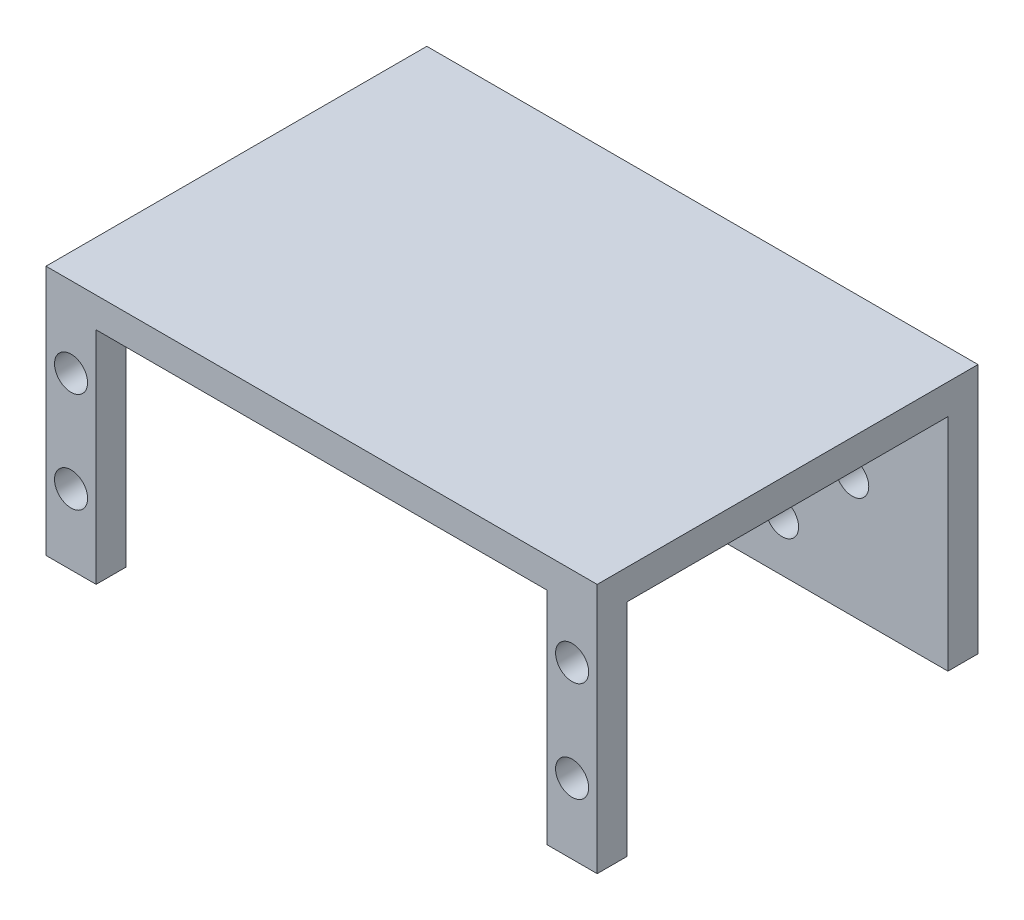
ISO-10303-21;
HEADER;
FILE_DESCRIPTION(('STEP AP214'),'2;1');
FILE_NAME('part.step','',(''),(''),'','','');
FILE_SCHEMA(('AUTOMOTIVE_DESIGN { 1 0 10303 214 1 1 1 1 }'));
ENDSEC;
DATA;
#1=APPLICATION_CONTEXT('core data for automotive mechanical design processes');
#2=APPLICATION_PROTOCOL_DEFINITION('international standard','automotive_design',2000,#1);
#3=PRODUCT_CONTEXT('',#1,'mechanical');
#4=PRODUCT('Part','Part','',(#3));
#5=PRODUCT_RELATED_PRODUCT_CATEGORY('part','',(#4));
#6=PRODUCT_DEFINITION_FORMATION('','',#4);
#7=PRODUCT_DEFINITION_CONTEXT('part definition',#1,'design');
#8=PRODUCT_DEFINITION('design','',#6,#7);
#9=PRODUCT_DEFINITION_SHAPE('','',#8);
#10=(LENGTH_UNIT() NAMED_UNIT(*) SI_UNIT(.MILLI.,.METRE.));
#11=(NAMED_UNIT(*) PLANE_ANGLE_UNIT() SI_UNIT($,.RADIAN.));
#12=(NAMED_UNIT(*) SI_UNIT($,.STERADIAN.) SOLID_ANGLE_UNIT());
#13=UNCERTAINTY_MEASURE_WITH_UNIT(LENGTH_MEASURE(1.E-05),#10,'distance_accuracy_value','');
#14=(GEOMETRIC_REPRESENTATION_CONTEXT(3) GLOBAL_UNCERTAINTY_ASSIGNED_CONTEXT((#13)) GLOBAL_UNIT_ASSIGNED_CONTEXT((#10,
#11,#12)) REPRESENTATION_CONTEXT('',''));
#15=CARTESIAN_POINT('',(0.,0.,0.));
#16=DIRECTION('',(0.,0.,1.));
#17=DIRECTION('',(1.,0.,0.));
#18=AXIS2_PLACEMENT_3D('',#15,#16,#17);
#19=CARTESIAN_POINT('',(-27.5,9.5,38.));
#20=DIRECTION('',(0.,1.,0.));
#21=DIRECTION('',(-1.,0.,0.));
#22=AXIS2_PLACEMENT_3D('',#19,#20,#21);
#23=PLANE('',#22);
#24=DIRECTION('',(0.,0.,-1.));
#25=VECTOR('',#24,1.);
#26=CARTESIAN_POINT('',(22.5,9.5,38.));
#27=LINE('',#26,#25);
#28=CARTESIAN_POINT('',(22.5,9.5,38.));
#29=VERTEX_POINT('',#28);
#30=CARTESIAN_POINT('',(22.5,9.5,35.));
#31=VERTEX_POINT('',#30);
#32=EDGE_CURVE('E156',#29,#31,#27,.T.);
#33=ORIENTED_EDGE('',*,*,#32,.F.);
#34=DIRECTION('',(1.,0.,0.));
#35=VECTOR('',#34,1.);
#36=CARTESIAN_POINT('',(-27.5,9.5,38.));
#37=LINE('',#36,#35);
#38=CARTESIAN_POINT('',(-22.5,9.5,38.));
#39=VERTEX_POINT('',#38);
#40=EDGE_CURVE('E140',#39,#29,#37,.T.);
#41=ORIENTED_EDGE('',*,*,#40,.F.);
#42=DIRECTION('',(0.,0.,1.));
#43=VECTOR('',#42,1.);
#44=CARTESIAN_POINT('',(-22.5,9.5,38.));
#45=LINE('',#44,#43);
#46=CARTESIAN_POINT('',(-22.5,9.5,35.));
#47=VERTEX_POINT('',#46);
#48=EDGE_CURVE('E176',#47,#39,#45,.T.);
#49=ORIENTED_EDGE('',*,*,#48,.F.);
#50=DIRECTION('',(1.,0.,0.));
#51=VECTOR('',#50,1.);
#52=CARTESIAN_POINT('',(-27.5,9.5,35.));
#53=LINE('',#52,#51);
#54=CARTESIAN_POINT('',(-27.5,9.5,35.));
#55=VERTEX_POINT('',#54);
#56=EDGE_CURVE('E171',#55,#47,#53,.T.);
#57=ORIENTED_EDGE('',*,*,#56,.F.);
#58=DIRECTION('',(0.,0.,-1.));
#59=VECTOR('',#58,1.);
#60=CARTESIAN_POINT('',(-27.5,9.5,38.));
#61=LINE('',#60,#59);
#62=CARTESIAN_POINT('',(-27.5,9.5,3.));
#63=VERTEX_POINT('',#62);
#64=EDGE_CURVE('E61',#55,#63,#61,.T.);
#65=ORIENTED_EDGE('',*,*,#64,.T.);
#66=DIRECTION('',(1.,0.,0.));
#67=VECTOR('',#66,1.);
#68=CARTESIAN_POINT('',(-27.5,9.5,3.));
#69=LINE('',#68,#67);
#70=CARTESIAN_POINT('',(27.5,9.5,3.));
#71=VERTEX_POINT('',#70);
#72=EDGE_CURVE('E191',#63,#71,#69,.T.);
#73=ORIENTED_EDGE('',*,*,#72,.T.);
#74=DIRECTION('',(0.,0.,-1.));
#75=VECTOR('',#74,1.);
#76=CARTESIAN_POINT('',(27.5,9.5,38.));
#77=LINE('',#76,#75);
#78=CARTESIAN_POINT('',(27.5,9.5,35.));
#79=VERTEX_POINT('',#78);
#80=EDGE_CURVE('E196',#79,#71,#77,.T.);
#81=ORIENTED_EDGE('',*,*,#80,.F.);
#82=DIRECTION('',(1.,0.,0.));
#83=VECTOR('',#82,1.);
#84=CARTESIAN_POINT('',(27.5,9.5,35.));
#85=LINE('',#84,#83);
#86=EDGE_CURVE('E154',#31,#79,#85,.T.);
#87=ORIENTED_EDGE('',*,*,#86,.F.);
#88=EDGE_LOOP('',(#33,#41,#49,#57,#65,#73,#81,#87));
#89=FACE_BOUND('',#88,.T.);
#90=ADVANCED_FACE('F36',(#89),#23,.F.);
#91=CARTESIAN_POINT('',(0.,0.,3.));
#92=DIRECTION('',(0.,0.,-1.));
#93=DIRECTION('',(-1.,0.,0.));
#94=AXIS2_PLACEMENT_3D('',#91,#92,#93);
#95=PLANE('',#94);
#96=CARTESIAN_POINT('',(17.95,-0.499999999999997,3.));
#97=DIRECTION('',(0.,0.,1.));
#98=DIRECTION('',(1.,0.,0.));
#99=AXIS2_PLACEMENT_3D('',#96,#97,#98);
#100=CIRCLE('',#99,1.65);
#101=CARTESIAN_POINT('',(19.6,-0.499999999999997,3.));
#102=VERTEX_POINT('',#101);
#103=EDGE_CURVE('E227',#102,#102,#100,.T.);
#104=ORIENTED_EDGE('',*,*,#103,.F.);
#105=EDGE_LOOP('',(#104));
#106=FACE_BOUND('',#105,.T.);
#107=CARTESIAN_POINT('',(10.95,6.5,3.));
#108=DIRECTION('',(0.,0.,1.));
#109=DIRECTION('',(1.,0.,0.));
#110=AXIS2_PLACEMENT_3D('',#107,#108,#109);
#111=CIRCLE('',#110,1.65);
#112=CARTESIAN_POINT('',(12.6,6.5,3.));
#113=VERTEX_POINT('',#112);
#114=EDGE_CURVE('E531',#113,#113,#111,.T.);
#115=ORIENTED_EDGE('',*,*,#114,.F.);
#116=EDGE_LOOP('',(#115));
#117=FACE_BOUND('',#116,.T.);
#118=CARTESIAN_POINT('',(3.94999999999999,-0.499999999999997,3.));
#119=DIRECTION('',(0.,0.,1.));
#120=DIRECTION('',(1.,0.,0.));
#121=AXIS2_PLACEMENT_3D('',#118,#119,#120);
#122=CIRCLE('',#121,1.65);
#123=CARTESIAN_POINT('',(5.59999999999999,-0.499999999999997,3.));
#124=VERTEX_POINT('',#123);
#125=EDGE_CURVE('E534',#124,#124,#122,.T.);
#126=ORIENTED_EDGE('',*,*,#125,.F.);
#127=EDGE_LOOP('',(#126));
#128=FACE_BOUND('',#127,.T.);
#129=CARTESIAN_POINT('',(10.95,-7.5,3.));
#130=DIRECTION('',(0.,0.,1.));
#131=DIRECTION('',(1.,0.,0.));
#132=AXIS2_PLACEMENT_3D('',#129,#130,#131);
#133=CIRCLE('',#132,1.65);
#134=CARTESIAN_POINT('',(12.6,-7.5,3.));
#135=VERTEX_POINT('',#134);
#136=EDGE_CURVE('E538',#135,#135,#133,.T.);
#137=ORIENTED_EDGE('',*,*,#136,.F.);
#138=EDGE_LOOP('',(#137));
#139=FACE_BOUND('',#138,.T.);
#140=ORIENTED_EDGE('',*,*,#72,.F.);
#141=DIRECTION('',(0.,-1.,0.));
#142=VECTOR('',#141,1.);
#143=CARTESIAN_POINT('',(-27.5,-12.5,3.));
#144=LINE('',#143,#142);
#145=CARTESIAN_POINT('',(-27.5,-12.5,3.));
#146=VERTEX_POINT('',#145);
#147=EDGE_CURVE('E204',#63,#146,#144,.T.);
#148=ORIENTED_EDGE('',*,*,#147,.T.);
#149=DIRECTION('',(1.,0.,0.));
#150=VECTOR('',#149,1.);
#151=CARTESIAN_POINT('',(-27.5,-12.5,3.));
#152=LINE('',#151,#150);
#153=CARTESIAN_POINT('',(27.5,-12.5,3.));
#154=VERTEX_POINT('',#153);
#155=EDGE_CURVE('E207',#146,#154,#152,.T.);
#156=ORIENTED_EDGE('',*,*,#155,.T.);
#157=DIRECTION('',(0.,1.,0.));
#158=VECTOR('',#157,1.);
#159=CARTESIAN_POINT('',(27.5,-12.5,3.));
#160=LINE('',#159,#158);
#161=EDGE_CURVE('E201',#154,#71,#160,.T.);
#162=ORIENTED_EDGE('',*,*,#161,.T.);
#163=EDGE_LOOP('',(#140,#148,#156,#162));
#164=FACE_BOUND('',#163,.T.);
#165=ADVANCED_FACE('F283',(#106,#117,#128,#139,#164),#95,.F.);
#166=CARTESIAN_POINT('',(27.5,-12.5,3.));
#167=DIRECTION('',(-1.,0.,0.));
#168=DIRECTION('',(0.,0.,1.));
#169=AXIS2_PLACEMENT_3D('',#166,#167,#168);
#170=PLANE('',#169);
#171=DIRECTION('',(0.,1.,0.));
#172=VECTOR('',#171,1.);
#173=CARTESIAN_POINT('',(27.5,-12.5,0.));
#174=LINE('',#173,#172);
#175=CARTESIAN_POINT('',(27.5,-12.5,0.));
#176=VERTEX_POINT('',#175);
#177=CARTESIAN_POINT('',(27.5,12.5,0.));
#178=VERTEX_POINT('',#177);
#179=EDGE_CURVE('E200',#176,#178,#174,.T.);
#180=ORIENTED_EDGE('',*,*,#179,.T.);
#181=DIRECTION('',(0.,0.,-1.));
#182=VECTOR('',#181,1.);
#183=CARTESIAN_POINT('',(27.5,12.5,3.));
#184=LINE('',#183,#182);
#185=CARTESIAN_POINT('',(27.5,12.5,38.));
#186=VERTEX_POINT('',#185);
#187=EDGE_CURVE('E11',#186,#178,#184,.T.);
#188=ORIENTED_EDGE('',*,*,#187,.F.);
#189=DIRECTION('',(0.,1.,0.));
#190=VECTOR('',#189,1.);
#191=CARTESIAN_POINT('',(27.5,12.5,38.));
#192=LINE('',#191,#190);
#193=CARTESIAN_POINT('',(27.5,-12.5,38.));
#194=VERTEX_POINT('',#193);
#195=EDGE_CURVE('E131',#194,#186,#192,.T.);
#196=ORIENTED_EDGE('',*,*,#195,.F.);
#197=DIRECTION('',(0.,0.,1.));
#198=VECTOR('',#197,1.);
#199=CARTESIAN_POINT('',(27.5,-12.5,38.));
#200=LINE('',#199,#198);
#201=CARTESIAN_POINT('',(27.5,-12.5,35.));
#202=VERTEX_POINT('',#201);
#203=EDGE_CURVE('E136',#202,#194,#200,.T.);
#204=ORIENTED_EDGE('',*,*,#203,.F.);
#205=DIRECTION('',(0.,1.,0.));
#206=VECTOR('',#205,1.);
#207=CARTESIAN_POINT('',(27.5,-12.5,35.));
#208=LINE('',#207,#206);
#209=EDGE_CURVE('E164',#202,#79,#208,.T.);
#210=ORIENTED_EDGE('',*,*,#209,.T.);
#211=ORIENTED_EDGE('',*,*,#80,.T.);
#212=ORIENTED_EDGE('',*,*,#161,.F.);
#213=DIRECTION('',(0.,0.,-1.));
#214=VECTOR('',#213,1.);
#215=CARTESIAN_POINT('',(27.5,-12.5,3.));
#216=LINE('',#215,#214);
#217=EDGE_CURVE('E209',#154,#176,#216,.T.);
#218=ORIENTED_EDGE('',*,*,#217,.T.);
#219=EDGE_LOOP('',(#180,#188,#196,#204,#210,#211,#212,#218));
#220=FACE_BOUND('',#219,.T.);
#221=ADVANCED_FACE('F38',(#220),#170,.F.);
#222=CARTESIAN_POINT('',(-27.5,12.5,3.));
#223=DIRECTION('',(0.,-1.,0.));
#224=DIRECTION('',(0.,0.,-1.));
#225=AXIS2_PLACEMENT_3D('',#222,#223,#224);
#226=PLANE('',#225);
#227=DIRECTION('',(-1.,0.,0.));
#228=VECTOR('',#227,1.);
#229=CARTESIAN_POINT('',(-27.5,12.5,0.));
#230=LINE('',#229,#228);
#231=CARTESIAN_POINT('',(-27.5,12.5,0.));
#232=VERTEX_POINT('',#231);
#233=EDGE_CURVE('E211',#178,#232,#230,.T.);
#234=ORIENTED_EDGE('',*,*,#233,.T.);
#235=DIRECTION('',(0.,0.,-1.));
#236=VECTOR('',#235,1.);
#237=CARTESIAN_POINT('',(-27.5,12.5,3.));
#238=LINE('',#237,#236);
#239=CARTESIAN_POINT('',(-27.5,12.5,38.));
#240=VERTEX_POINT('',#239);
#241=EDGE_CURVE('E45',#240,#232,#238,.T.);
#242=ORIENTED_EDGE('',*,*,#241,.F.);
#243=DIRECTION('',(-1.,0.,0.));
#244=VECTOR('',#243,1.);
#245=CARTESIAN_POINT('',(-27.5,12.5,38.));
#246=LINE('',#245,#244);
#247=EDGE_CURVE('E139',#186,#240,#246,.T.);
#248=ORIENTED_EDGE('',*,*,#247,.F.);
#249=ORIENTED_EDGE('',*,*,#187,.T.);
#250=EDGE_LOOP('',(#234,#242,#248,#249));
#251=FACE_BOUND('',#250,.T.);
#252=ADVANCED_FACE('F298',(#251),#226,.F.);
#253=CARTESIAN_POINT('',(-27.5,-12.5,3.));
#254=DIRECTION('',(1.,0.,0.));
#255=DIRECTION('',(0.,0.,-1.));
#256=AXIS2_PLACEMENT_3D('',#253,#254,#255);
#257=PLANE('',#256);
#258=DIRECTION('',(0.,-1.,0.));
#259=VECTOR('',#258,1.);
#260=CARTESIAN_POINT('',(-27.5,-12.5,0.));
#261=LINE('',#260,#259);
#262=CARTESIAN_POINT('',(-27.5,-12.5,0.));
#263=VERTEX_POINT('',#262);
#264=EDGE_CURVE('E213',#232,#263,#261,.T.);
#265=ORIENTED_EDGE('',*,*,#264,.T.);
#266=DIRECTION('',(0.,0.,-1.));
#267=VECTOR('',#266,1.);
#268=CARTESIAN_POINT('',(-27.5,-12.5,3.));
#269=LINE('',#268,#267);
#270=EDGE_CURVE('E218',#146,#263,#269,.T.);
#271=ORIENTED_EDGE('',*,*,#270,.F.);
#272=ORIENTED_EDGE('',*,*,#147,.F.);
#273=ORIENTED_EDGE('',*,*,#64,.F.);
#274=DIRECTION('',(0.,1.,0.));
#275=VECTOR('',#274,1.);
#276=CARTESIAN_POINT('',(-27.5,-12.5,35.));
#277=LINE('',#276,#275);
#278=CARTESIAN_POINT('',(-27.5,-12.5,35.));
#279=VERTEX_POINT('',#278);
#280=EDGE_CURVE('E189',#279,#55,#277,.T.);
#281=ORIENTED_EDGE('',*,*,#280,.F.);
#282=DIRECTION('',(0.,0.,-1.));
#283=VECTOR('',#282,1.);
#284=CARTESIAN_POINT('',(-27.5,-12.5,38.));
#285=LINE('',#284,#283);
#286=CARTESIAN_POINT('',(-27.5,-12.5,38.));
#287=VERTEX_POINT('',#286);
#288=EDGE_CURVE('E172',#287,#279,#285,.T.);
#289=ORIENTED_EDGE('',*,*,#288,.F.);
#290=DIRECTION('',(0.,-1.,0.));
#291=VECTOR('',#290,1.);
#292=CARTESIAN_POINT('',(-27.5,12.5,38.));
#293=LINE('',#292,#291);
#294=EDGE_CURVE('E192',#240,#287,#293,.T.);
#295=ORIENTED_EDGE('',*,*,#294,.F.);
#296=ORIENTED_EDGE('',*,*,#241,.T.);
#297=EDGE_LOOP('',(#265,#271,#272,#273,#281,#289,#295,#296));
#298=FACE_BOUND('',#297,.T.);
#299=ADVANCED_FACE('F286',(#298),#257,.F.);
#300=CARTESIAN_POINT('',(-27.5,-12.5,3.));
#301=DIRECTION('',(0.,1.,0.));
#302=DIRECTION('',(0.,0.,1.));
#303=AXIS2_PLACEMENT_3D('',#300,#301,#302);
#304=PLANE('',#303);
#305=DIRECTION('',(1.,0.,0.));
#306=VECTOR('',#305,1.);
#307=CARTESIAN_POINT('',(-27.5,-12.5,0.));
#308=LINE('',#307,#306);
#309=EDGE_CURVE('E205',#263,#176,#308,.T.);
#310=ORIENTED_EDGE('',*,*,#309,.T.);
#311=ORIENTED_EDGE('',*,*,#217,.F.);
#312=ORIENTED_EDGE('',*,*,#155,.F.);
#313=ORIENTED_EDGE('',*,*,#270,.T.);
#314=EDGE_LOOP('',(#310,#311,#312,#313));
#315=FACE_BOUND('',#314,.T.);
#316=ADVANCED_FACE('F293',(#315),#304,.F.);
#317=CARTESIAN_POINT('',(0.,0.,0.));
#318=DIRECTION('',(0.,0.,-1.));
#319=DIRECTION('',(-1.,0.,0.));
#320=AXIS2_PLACEMENT_3D('',#317,#318,#319);
#321=PLANE('',#320);
#322=CARTESIAN_POINT('',(17.95,-0.499999999999997,0.));
#323=DIRECTION('',(0.,0.,-1.));
#324=DIRECTION('',(-1.,0.,0.));
#325=AXIS2_PLACEMENT_3D('',#322,#323,#324);
#326=CIRCLE('',#325,1.65);
#327=CARTESIAN_POINT('',(16.3,-0.499999999999997,0.));
#328=VERTEX_POINT('',#327);
#329=EDGE_CURVE('E40',#328,#328,#326,.T.);
#330=ORIENTED_EDGE('',*,*,#329,.F.);
#331=EDGE_LOOP('',(#330));
#332=FACE_BOUND('',#331,.T.);
#333=CARTESIAN_POINT('',(10.95,6.5,0.));
#334=DIRECTION('',(0.,0.,-1.));
#335=DIRECTION('',(-1.,0.,0.));
#336=AXIS2_PLACEMENT_3D('',#333,#334,#335);
#337=CIRCLE('',#336,1.65);
#338=CARTESIAN_POINT('',(9.29999999999999,6.5,0.));
#339=VERTEX_POINT('',#338);
#340=EDGE_CURVE('E229',#339,#339,#337,.T.);
#341=ORIENTED_EDGE('',*,*,#340,.F.);
#342=EDGE_LOOP('',(#341));
#343=FACE_BOUND('',#342,.T.);
#344=CARTESIAN_POINT('',(3.94999999999999,-0.499999999999997,0.));
#345=DIRECTION('',(0.,0.,-1.));
#346=DIRECTION('',(-1.,0.,0.));
#347=AXIS2_PLACEMENT_3D('',#344,#345,#346);
#348=CIRCLE('',#347,1.65);
#349=CARTESIAN_POINT('',(2.29999999999999,-0.499999999999997,0.));
#350=VERTEX_POINT('',#349);
#351=EDGE_CURVE('E226',#350,#350,#348,.T.);
#352=ORIENTED_EDGE('',*,*,#351,.F.);
#353=EDGE_LOOP('',(#352));
#354=FACE_BOUND('',#353,.T.);
#355=CARTESIAN_POINT('',(10.95,-7.5,0.));
#356=DIRECTION('',(0.,0.,-1.));
#357=DIRECTION('',(-1.,0.,0.));
#358=AXIS2_PLACEMENT_3D('',#355,#356,#357);
#359=CIRCLE('',#358,1.65);
#360=CARTESIAN_POINT('',(9.29999999999999,-7.5,0.));
#361=VERTEX_POINT('',#360);
#362=EDGE_CURVE('E223',#361,#361,#359,.T.);
#363=ORIENTED_EDGE('',*,*,#362,.F.);
#364=EDGE_LOOP('',(#363));
#365=FACE_BOUND('',#364,.T.);
#366=ORIENTED_EDGE('',*,*,#179,.F.);
#367=ORIENTED_EDGE('',*,*,#309,.F.);
#368=ORIENTED_EDGE('',*,*,#264,.F.);
#369=ORIENTED_EDGE('',*,*,#233,.F.);
#370=EDGE_LOOP('',(#366,#367,#368,#369));
#371=FACE_BOUND('',#370,.T.);
#372=ADVANCED_FACE('F296',(#332,#343,#354,#365,#371),#321,.T.);
#373=CARTESIAN_POINT('',(0.,0.,38.));
#374=DIRECTION('',(0.,0.,1.));
#375=DIRECTION('',(1.,0.,0.));
#376=AXIS2_PLACEMENT_3D('',#373,#374,#375);
#377=PLANE('',#376);
#378=CARTESIAN_POINT('',(25.,-5.5,38.));
#379=DIRECTION('',(0.,0.,1.));
#380=DIRECTION('',(-1.,0.,0.));
#381=AXIS2_PLACEMENT_3D('',#378,#379,#380);
#382=CIRCLE('',#381,1.65);
#383=CARTESIAN_POINT('',(23.35,-5.5,38.));
#384=VERTEX_POINT('',#383);
#385=EDGE_CURVE('E234',#384,#384,#382,.T.);
#386=ORIENTED_EDGE('',*,*,#385,.F.);
#387=EDGE_LOOP('',(#386));
#388=FACE_BOUND('',#387,.T.);
#389=CARTESIAN_POINT('',(25.,4.5,38.));
#390=DIRECTION('',(0.,0.,1.));
#391=DIRECTION('',(-1.,0.,0.));
#392=AXIS2_PLACEMENT_3D('',#389,#390,#391);
#393=CIRCLE('',#392,1.65);
#394=CARTESIAN_POINT('',(23.35,4.5,38.));
#395=VERTEX_POINT('',#394);
#396=EDGE_CURVE('E243',#395,#395,#393,.T.);
#397=ORIENTED_EDGE('',*,*,#396,.F.);
#398=EDGE_LOOP('',(#397));
#399=FACE_BOUND('',#398,.T.);
#400=CARTESIAN_POINT('',(-25.,4.5,38.));
#401=DIRECTION('',(0.,0.,1.));
#402=DIRECTION('',(1.,0.,0.));
#403=AXIS2_PLACEMENT_3D('',#400,#401,#402);
#404=CIRCLE('',#403,1.65);
#405=CARTESIAN_POINT('',(-23.35,4.5,38.));
#406=VERTEX_POINT('',#405);
#407=EDGE_CURVE('E255',#406,#406,#404,.T.);
#408=ORIENTED_EDGE('',*,*,#407,.F.);
#409=EDGE_LOOP('',(#408));
#410=FACE_BOUND('',#409,.T.);
#411=CARTESIAN_POINT('',(-25.,-5.5,38.));
#412=DIRECTION('',(0.,0.,1.));
#413=DIRECTION('',(1.,0.,0.));
#414=AXIS2_PLACEMENT_3D('',#411,#412,#413);
#415=CIRCLE('',#414,1.65);
#416=CARTESIAN_POINT('',(-23.35,-5.5,38.));
#417=VERTEX_POINT('',#416);
#418=EDGE_CURVE('E248',#417,#417,#415,.T.);
#419=ORIENTED_EDGE('',*,*,#418,.F.);
#420=EDGE_LOOP('',(#419));
#421=FACE_BOUND('',#420,.T.);
#422=ORIENTED_EDGE('',*,*,#294,.T.);
#423=DIRECTION('',(-1.,0.,0.));
#424=VECTOR('',#423,1.);
#425=CARTESIAN_POINT('',(-27.5,-12.5,38.));
#426=LINE('',#425,#424);
#427=CARTESIAN_POINT('',(-22.5,-12.5,38.));
#428=VERTEX_POINT('',#427);
#429=EDGE_CURVE('E180',#428,#287,#426,.T.);
#430=ORIENTED_EDGE('',*,*,#429,.F.);
#431=DIRECTION('',(0.,1.,0.));
#432=VECTOR('',#431,1.);
#433=CARTESIAN_POINT('',(-22.5,-12.5,38.));
#434=LINE('',#433,#432);
#435=EDGE_CURVE('E53',#428,#39,#434,.T.);
#436=ORIENTED_EDGE('',*,*,#435,.T.);
#437=ORIENTED_EDGE('',*,*,#40,.T.);
#438=DIRECTION('',(0.,1.,0.));
#439=VECTOR('',#438,1.);
#440=CARTESIAN_POINT('',(22.5,-12.5,38.));
#441=LINE('',#440,#439);
#442=CARTESIAN_POINT('',(22.5,-12.5,38.));
#443=VERTEX_POINT('',#442);
#444=EDGE_CURVE('E145',#443,#29,#441,.T.);
#445=ORIENTED_EDGE('',*,*,#444,.F.);
#446=DIRECTION('',(-1.,0.,0.));
#447=VECTOR('',#446,1.);
#448=CARTESIAN_POINT('',(27.5,-12.5,38.));
#449=LINE('',#448,#447);
#450=EDGE_CURVE('E143',#194,#443,#449,.T.);
#451=ORIENTED_EDGE('',*,*,#450,.F.);
#452=ORIENTED_EDGE('',*,*,#195,.T.);
#453=ORIENTED_EDGE('',*,*,#247,.T.);
#454=EDGE_LOOP('',(#422,#430,#436,#437,#445,#451,#452,#453));
#455=FACE_BOUND('',#454,.T.);
#456=ADVANCED_FACE('F144',(#388,#399,#410,#421,#455),#377,.T.);
#457=CARTESIAN_POINT('',(-27.5,-12.5,35.));
#458=DIRECTION('',(0.,0.,1.));
#459=DIRECTION('',(1.,0.,0.));
#460=AXIS2_PLACEMENT_3D('',#457,#458,#459);
#461=PLANE('',#460);
#462=CARTESIAN_POINT('',(-25.,4.5,35.));
#463=DIRECTION('',(0.,0.,1.));
#464=DIRECTION('',(1.,0.,0.));
#465=AXIS2_PLACEMENT_3D('',#462,#463,#464);
#466=CIRCLE('',#465,1.65);
#467=CARTESIAN_POINT('',(-23.35,4.5,35.));
#468=VERTEX_POINT('',#467);
#469=EDGE_CURVE('E250',#468,#468,#466,.F.);
#470=ORIENTED_EDGE('',*,*,#469,.F.);
#471=EDGE_LOOP('',(#470));
#472=FACE_BOUND('',#471,.T.);
#473=CARTESIAN_POINT('',(-25.,-5.5,35.));
#474=DIRECTION('',(0.,0.,1.));
#475=DIRECTION('',(1.,0.,0.));
#476=AXIS2_PLACEMENT_3D('',#473,#474,#475);
#477=CIRCLE('',#476,1.65);
#478=CARTESIAN_POINT('',(-23.35,-5.5,35.));
#479=VERTEX_POINT('',#478);
#480=EDGE_CURVE('E159',#479,#479,#477,.F.);
#481=ORIENTED_EDGE('',*,*,#480,.F.);
#482=EDGE_LOOP('',(#481));
#483=FACE_BOUND('',#482,.T.);
#484=ORIENTED_EDGE('',*,*,#56,.T.);
#485=DIRECTION('',(0.,1.,0.));
#486=VECTOR('',#485,1.);
#487=CARTESIAN_POINT('',(-22.5,-12.5,35.));
#488=LINE('',#487,#486);
#489=CARTESIAN_POINT('',(-22.5,-12.5,35.));
#490=VERTEX_POINT('',#489);
#491=EDGE_CURVE('E186',#490,#47,#488,.T.);
#492=ORIENTED_EDGE('',*,*,#491,.F.);
#493=DIRECTION('',(1.,0.,0.));
#494=VECTOR('',#493,1.);
#495=CARTESIAN_POINT('',(-27.5,-12.5,35.));
#496=LINE('',#495,#494);
#497=EDGE_CURVE('E175',#279,#490,#496,.T.);
#498=ORIENTED_EDGE('',*,*,#497,.F.);
#499=ORIENTED_EDGE('',*,*,#280,.T.);
#500=EDGE_LOOP('',(#484,#492,#498,#499));
#501=FACE_BOUND('',#500,.T.);
#502=ADVANCED_FACE('F462',(#472,#483,#501),#461,.F.);
#503=CARTESIAN_POINT('',(-22.5,-12.5,38.));
#504=DIRECTION('',(-1.,0.,0.));
#505=DIRECTION('',(0.,-1.,0.));
#506=AXIS2_PLACEMENT_3D('',#503,#504,#505);
#507=PLANE('',#506);
#508=ORIENTED_EDGE('',*,*,#48,.T.);
#509=ORIENTED_EDGE('',*,*,#435,.F.);
#510=DIRECTION('',(0.,0.,1.));
#511=VECTOR('',#510,1.);
#512=CARTESIAN_POINT('',(-22.5,-12.5,38.));
#513=LINE('',#512,#511);
#514=EDGE_CURVE('E178',#490,#428,#513,.T.);
#515=ORIENTED_EDGE('',*,*,#514,.F.);
#516=ORIENTED_EDGE('',*,*,#491,.T.);
#517=EDGE_LOOP('',(#508,#509,#515,#516));
#518=FACE_BOUND('',#517,.T.);
#519=ADVANCED_FACE('F306',(#518),#507,.F.);
#520=CARTESIAN_POINT('',(0.,-12.5,0.));
#521=DIRECTION('',(0.,-1.,0.));
#522=DIRECTION('',(1.,0.,0.));
#523=AXIS2_PLACEMENT_3D('',#520,#521,#522);
#524=PLANE('',#523);
#525=ORIENTED_EDGE('',*,*,#288,.T.);
#526=ORIENTED_EDGE('',*,*,#497,.T.);
#527=ORIENTED_EDGE('',*,*,#514,.T.);
#528=ORIENTED_EDGE('',*,*,#429,.T.);
#529=EDGE_LOOP('',(#525,#526,#527,#528));
#530=FACE_BOUND('',#529,.T.);
#531=ADVANCED_FACE('F302',(#530),#524,.T.);
#532=CARTESIAN_POINT('',(22.5,-12.5,38.));
#533=DIRECTION('',(1.,0.,0.));
#534=DIRECTION('',(0.,1.,0.));
#535=AXIS2_PLACEMENT_3D('',#532,#533,#534);
#536=PLANE('',#535);
#537=ORIENTED_EDGE('',*,*,#32,.T.);
#538=DIRECTION('',(0.,1.,0.));
#539=VECTOR('',#538,1.);
#540=CARTESIAN_POINT('',(22.5,-12.5,35.));
#541=LINE('',#540,#539);
#542=CARTESIAN_POINT('',(22.5,-12.5,35.));
#543=VERTEX_POINT('',#542);
#544=EDGE_CURVE('E167',#543,#31,#541,.T.);
#545=ORIENTED_EDGE('',*,*,#544,.F.);
#546=DIRECTION('',(0.,0.,-1.));
#547=VECTOR('',#546,1.);
#548=CARTESIAN_POINT('',(22.5,-12.5,38.));
#549=LINE('',#548,#547);
#550=EDGE_CURVE('E148',#443,#543,#549,.T.);
#551=ORIENTED_EDGE('',*,*,#550,.F.);
#552=ORIENTED_EDGE('',*,*,#444,.T.);
#553=EDGE_LOOP('',(#537,#545,#551,#552));
#554=FACE_BOUND('',#553,.T.);
#555=ADVANCED_FACE('F273',(#554),#536,.F.);
#556=CARTESIAN_POINT('',(27.5,-12.5,35.));
#557=DIRECTION('',(0.,0.,1.));
#558=DIRECTION('',(1.,0.,0.));
#559=AXIS2_PLACEMENT_3D('',#556,#557,#558);
#560=PLANE('',#559);
#561=CARTESIAN_POINT('',(25.,-5.5,35.));
#562=DIRECTION('',(0.,0.,1.));
#563=DIRECTION('',(1.,0.,0.));
#564=AXIS2_PLACEMENT_3D('',#561,#562,#563);
#565=CIRCLE('',#564,1.65);
#566=CARTESIAN_POINT('',(26.65,-5.5,35.));
#567=VERTEX_POINT('',#566);
#568=EDGE_CURVE('E238',#567,#567,#565,.F.);
#569=ORIENTED_EDGE('',*,*,#568,.F.);
#570=EDGE_LOOP('',(#569));
#571=FACE_BOUND('',#570,.T.);
#572=CARTESIAN_POINT('',(25.,4.5,35.));
#573=DIRECTION('',(0.,0.,1.));
#574=DIRECTION('',(1.,0.,0.));
#575=AXIS2_PLACEMENT_3D('',#572,#573,#574);
#576=CIRCLE('',#575,1.65);
#577=CARTESIAN_POINT('',(26.65,4.5,35.));
#578=VERTEX_POINT('',#577);
#579=EDGE_CURVE('E246',#578,#578,#576,.F.);
#580=ORIENTED_EDGE('',*,*,#579,.F.);
#581=EDGE_LOOP('',(#580));
#582=FACE_BOUND('',#581,.T.);
#583=ORIENTED_EDGE('',*,*,#86,.T.);
#584=ORIENTED_EDGE('',*,*,#209,.F.);
#585=DIRECTION('',(1.,0.,0.));
#586=VECTOR('',#585,1.);
#587=CARTESIAN_POINT('',(27.5,-12.5,35.));
#588=LINE('',#587,#586);
#589=EDGE_CURVE('E152',#543,#202,#588,.T.);
#590=ORIENTED_EDGE('',*,*,#589,.F.);
#591=ORIENTED_EDGE('',*,*,#544,.T.);
#592=EDGE_LOOP('',(#583,#584,#590,#591));
#593=FACE_BOUND('',#592,.T.);
#594=ADVANCED_FACE('F270',(#571,#582,#593),#560,.F.);
#595=CARTESIAN_POINT('',(0.,-12.5,0.));
#596=DIRECTION('',(0.,1.,0.));
#597=DIRECTION('',(-1.,0.,0.));
#598=AXIS2_PLACEMENT_3D('',#595,#596,#597);
#599=PLANE('',#598);
#600=ORIENTED_EDGE('',*,*,#203,.T.);
#601=ORIENTED_EDGE('',*,*,#450,.T.);
#602=ORIENTED_EDGE('',*,*,#550,.T.);
#603=ORIENTED_EDGE('',*,*,#589,.T.);
#604=EDGE_LOOP('',(#600,#601,#602,#603));
#605=FACE_BOUND('',#604,.T.);
#606=ADVANCED_FACE('F150',(#605),#599,.F.);
#607=CARTESIAN_POINT('',(25.,4.5,-0.001000000000001));
#608=DIRECTION('',(0.,0.,1.));
#609=DIRECTION('',(1.,0.,0.));
#610=AXIS2_PLACEMENT_3D('',#607,#608,#609);
#611=CYLINDRICAL_SURFACE('',#610,1.65);
#612=ORIENTED_EDGE('',*,*,#396,.T.);
#613=EDGE_LOOP('',(#612));
#614=FACE_BOUND('',#613,.T.);
#615=ORIENTED_EDGE('',*,*,#579,.T.);
#616=EDGE_LOOP('',(#615));
#617=FACE_BOUND('',#616,.T.);
#618=ADVANCED_FACE('F268',(#614,#617),#611,.F.);
#619=CARTESIAN_POINT('',(25.,-5.5,-0.001000000000001));
#620=DIRECTION('',(0.,0.,1.));
#621=DIRECTION('',(1.,0.,0.));
#622=AXIS2_PLACEMENT_3D('',#619,#620,#621);
#623=CYLINDRICAL_SURFACE('',#622,1.65);
#624=ORIENTED_EDGE('',*,*,#385,.T.);
#625=EDGE_LOOP('',(#624));
#626=FACE_BOUND('',#625,.T.);
#627=ORIENTED_EDGE('',*,*,#568,.T.);
#628=EDGE_LOOP('',(#627));
#629=FACE_BOUND('',#628,.T.);
#630=ADVANCED_FACE('F407',(#626,#629),#623,.F.);
#631=CARTESIAN_POINT('',(-25.,-5.5,-0.001000000000001));
#632=DIRECTION('',(0.,0.,1.));
#633=DIRECTION('',(1.,0.,0.));
#634=AXIS2_PLACEMENT_3D('',#631,#632,#633);
#635=CYLINDRICAL_SURFACE('',#634,1.65);
#636=ORIENTED_EDGE('',*,*,#418,.T.);
#637=EDGE_LOOP('',(#636));
#638=FACE_BOUND('',#637,.T.);
#639=ORIENTED_EDGE('',*,*,#480,.T.);
#640=EDGE_LOOP('',(#639));
#641=FACE_BOUND('',#640,.T.);
#642=ADVANCED_FACE('F403',(#638,#641),#635,.F.);
#643=CARTESIAN_POINT('',(-25.,4.5,-0.001000000000001));
#644=DIRECTION('',(0.,0.,1.));
#645=DIRECTION('',(1.,0.,0.));
#646=AXIS2_PLACEMENT_3D('',#643,#644,#645);
#647=CYLINDRICAL_SURFACE('',#646,1.65);
#648=ORIENTED_EDGE('',*,*,#407,.T.);
#649=EDGE_LOOP('',(#648));
#650=FACE_BOUND('',#649,.T.);
#651=ORIENTED_EDGE('',*,*,#469,.T.);
#652=EDGE_LOOP('',(#651));
#653=FACE_BOUND('',#652,.T.);
#654=ADVANCED_FACE('F351',(#650,#653),#647,.F.);
#655=CARTESIAN_POINT('',(10.95,-7.5,-17.));
#656=DIRECTION('',(0.,0.,1.));
#657=DIRECTION('',(1.,0.,0.));
#658=AXIS2_PLACEMENT_3D('',#655,#656,#657);
#659=CYLINDRICAL_SURFACE('',#658,1.65);
#660=ORIENTED_EDGE('',*,*,#362,.T.);
#661=EDGE_LOOP('',(#660));
#662=FACE_BOUND('',#661,.T.);
#663=ORIENTED_EDGE('',*,*,#136,.T.);
#664=EDGE_LOOP('',(#663));
#665=FACE_BOUND('',#664,.T.);
#666=ADVANCED_FACE('F363',(#662,#665),#659,.F.);
#667=CARTESIAN_POINT('',(3.94999999999999,-0.499999999999997,-17.));
#668=DIRECTION('',(0.,0.,1.));
#669=DIRECTION('',(1.,0.,0.));
#670=AXIS2_PLACEMENT_3D('',#667,#668,#669);
#671=CYLINDRICAL_SURFACE('',#670,1.65);
#672=ORIENTED_EDGE('',*,*,#351,.T.);
#673=EDGE_LOOP('',(#672));
#674=FACE_BOUND('',#673,.T.);
#675=ORIENTED_EDGE('',*,*,#125,.T.);
#676=EDGE_LOOP('',(#675));
#677=FACE_BOUND('',#676,.T.);
#678=ADVANCED_FACE('F368',(#674,#677),#671,.F.);
#679=CARTESIAN_POINT('',(10.95,6.5,-17.));
#680=DIRECTION('',(0.,0.,1.));
#681=DIRECTION('',(1.,0.,0.));
#682=AXIS2_PLACEMENT_3D('',#679,#680,#681);
#683=CYLINDRICAL_SURFACE('',#682,1.65);
#684=ORIENTED_EDGE('',*,*,#340,.T.);
#685=EDGE_LOOP('',(#684));
#686=FACE_BOUND('',#685,.T.);
#687=ORIENTED_EDGE('',*,*,#114,.T.);
#688=EDGE_LOOP('',(#687));
#689=FACE_BOUND('',#688,.T.);
#690=ADVANCED_FACE('F378',(#686,#689),#683,.F.);
#691=CARTESIAN_POINT('',(17.95,-0.499999999999997,-17.));
#692=DIRECTION('',(0.,0.,1.));
#693=DIRECTION('',(1.,0.,0.));
#694=AXIS2_PLACEMENT_3D('',#691,#692,#693);
#695=CYLINDRICAL_SURFACE('',#694,1.65);
#696=ORIENTED_EDGE('',*,*,#329,.T.);
#697=EDGE_LOOP('',(#696));
#698=FACE_BOUND('',#697,.T.);
#699=ORIENTED_EDGE('',*,*,#103,.T.);
#700=EDGE_LOOP('',(#699));
#701=FACE_BOUND('',#700,.T.);
#702=ADVANCED_FACE('F388',(#698,#701),#695,.F.);
#703=CLOSED_SHELL('',(#90,#165,#221,#252,#299,#316,#372,#456,#502,#519,#531,#555,#594,#606,#618,
#630,#642,#654,#666,#678,#690,#702));
#704=MANIFOLD_SOLID_BREP('B2',#703);
#705=ADVANCED_BREP_SHAPE_REPRESENTATION('',(#18,#704),#14);
#706=SHAPE_DEFINITION_REPRESENTATION(#9,#705);
ENDSEC;
END-ISO-10303-21;
